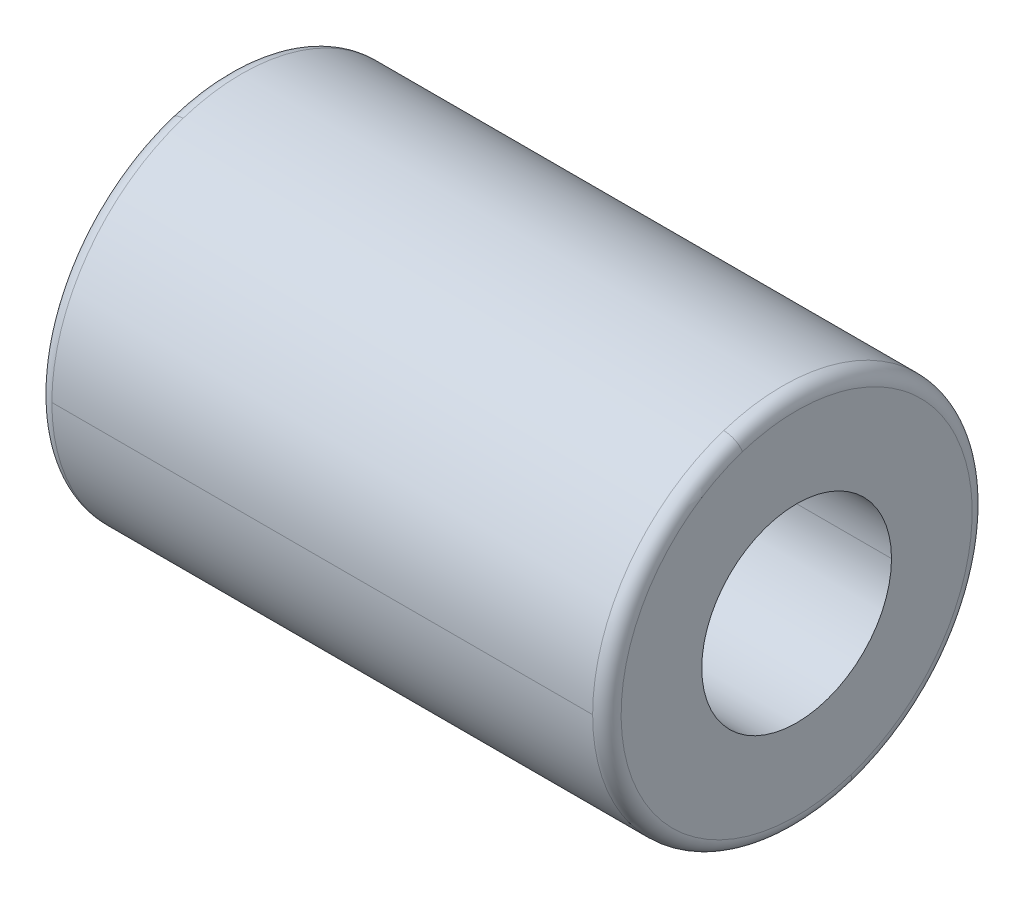
ISO-10303-21;
HEADER;
FILE_DESCRIPTION(('STEP AP214'),'2;1');
FILE_NAME('part.step','',(''),(''),'','','');
FILE_SCHEMA(('AUTOMOTIVE_DESIGN { 1 0 10303 214 1 1 1 1 }'));
ENDSEC;
DATA;
#1=APPLICATION_CONTEXT('core data for automotive mechanical design processes');
#2=APPLICATION_PROTOCOL_DEFINITION('international standard','automotive_design',2000,#1);
#3=PRODUCT_CONTEXT('',#1,'mechanical');
#4=PRODUCT('Part','Part','',(#3));
#5=PRODUCT_RELATED_PRODUCT_CATEGORY('part','',(#4));
#6=PRODUCT_DEFINITION_FORMATION('','',#4);
#7=PRODUCT_DEFINITION_CONTEXT('part definition',#1,'design');
#8=PRODUCT_DEFINITION('design','',#6,#7);
#9=PRODUCT_DEFINITION_SHAPE('','',#8);
#10=(LENGTH_UNIT() NAMED_UNIT(*) SI_UNIT(.MILLI.,.METRE.));
#11=(NAMED_UNIT(*) PLANE_ANGLE_UNIT() SI_UNIT($,.RADIAN.));
#12=(NAMED_UNIT(*) SI_UNIT($,.STERADIAN.) SOLID_ANGLE_UNIT());
#13=UNCERTAINTY_MEASURE_WITH_UNIT(LENGTH_MEASURE(1.E-05),#10,'distance_accuracy_value','');
#14=(GEOMETRIC_REPRESENTATION_CONTEXT(3) GLOBAL_UNCERTAINTY_ASSIGNED_CONTEXT((#13)) GLOBAL_UNIT_ASSIGNED_CONTEXT((#10,
#11,#12)) REPRESENTATION_CONTEXT('',''));
#15=CARTESIAN_POINT('',(0.,0.,0.));
#16=DIRECTION('',(0.,0.,1.));
#17=DIRECTION('',(1.,0.,0.));
#18=AXIS2_PLACEMENT_3D('',#15,#16,#17);
#19=CARTESIAN_POINT('',(12.,0.,0.));
#20=DIRECTION('',(1.,0.,0.));
#21=DIRECTION('',(0.,1.,0.));
#22=AXIS2_PLACEMENT_3D('',#19,#20,#21);
#23=CYLINDRICAL_SURFACE('',#22,2.);
#24=DIRECTION('',(1.,0.,0.));
#25=VECTOR('',#24,1.);
#26=CARTESIAN_POINT('',(0.,0.,2.));
#27=LINE('',#26,#25);
#28=CARTESIAN_POINT('',(0.,0.,2.));
#29=VERTEX_POINT('',#28);
#30=CARTESIAN_POINT('',(12.,0.,2.));
#31=VERTEX_POINT('',#30);
#32=EDGE_CURVE('E27',#29,#31,#27,.T.);
#33=ORIENTED_EDGE('',*,*,#32,.T.);
#34=CARTESIAN_POINT('',(12.,0.,0.));
#35=DIRECTION('',(1.,0.,0.));
#36=DIRECTION('',(0.,0.,-1.));
#37=AXIS2_PLACEMENT_3D('',#34,#35,#36);
#38=CIRCLE('',#37,2.);
#39=CARTESIAN_POINT('',(12.,0.,-2.));
#40=VERTEX_POINT('',#39);
#41=EDGE_CURVE('E167',#31,#40,#38,.T.);
#42=ORIENTED_EDGE('',*,*,#41,.T.);
#43=DIRECTION('',(1.,0.,0.));
#44=VECTOR('',#43,1.);
#45=CARTESIAN_POINT('',(0.,0.,-2.));
#46=LINE('',#45,#44);
#47=CARTESIAN_POINT('',(0.,0.,-2.));
#48=VERTEX_POINT('',#47);
#49=EDGE_CURVE('E11',#48,#40,#46,.T.);
#50=ORIENTED_EDGE('',*,*,#49,.F.);
#51=CARTESIAN_POINT('',(0.,0.,0.));
#52=DIRECTION('',(1.,0.,0.));
#53=DIRECTION('',(0.,0.,-1.));
#54=AXIS2_PLACEMENT_3D('',#51,#52,#53);
#55=CIRCLE('',#54,2.);
#56=EDGE_CURVE('E129',#29,#48,#55,.T.);
#57=ORIENTED_EDGE('',*,*,#56,.F.);
#58=EDGE_LOOP('',(#33,#42,#50,#57));
#59=FACE_BOUND('',#58,.T.);
#60=ADVANCED_FACE('F17',(#59),#23,.F.);
#61=CARTESIAN_POINT('',(12.,0.,0.));
#62=DIRECTION('',(1.,0.,0.));
#63=DIRECTION('',(0.,-1.,0.));
#64=AXIS2_PLACEMENT_3D('',#61,#62,#63);
#65=CYLINDRICAL_SURFACE('',#64,2.);
#66=ORIENTED_EDGE('',*,*,#32,.F.);
#67=CARTESIAN_POINT('',(0.,0.,0.));
#68=DIRECTION('',(1.,0.,0.));
#69=DIRECTION('',(0.,0.,-1.));
#70=AXIS2_PLACEMENT_3D('',#67,#68,#69);
#71=CIRCLE('',#70,2.);
#72=EDGE_CURVE('E135',#48,#29,#71,.T.);
#73=ORIENTED_EDGE('',*,*,#72,.F.);
#74=ORIENTED_EDGE('',*,*,#49,.T.);
#75=CARTESIAN_POINT('',(12.,0.,0.));
#76=DIRECTION('',(1.,0.,0.));
#77=DIRECTION('',(0.,0.,-1.));
#78=AXIS2_PLACEMENT_3D('',#75,#76,#77);
#79=CIRCLE('',#78,2.);
#80=EDGE_CURVE('E171',#40,#31,#79,.T.);
#81=ORIENTED_EDGE('',*,*,#80,.T.);
#82=EDGE_LOOP('',(#66,#73,#74,#81));
#83=FACE_BOUND('',#82,.T.);
#84=ADVANCED_FACE('F19',(#83),#65,.F.);
#85=CARTESIAN_POINT('',(12.,2.,0.));
#86=DIRECTION('',(1.,0.,0.));
#87=DIRECTION('',(0.,1.,0.));
#88=AXIS2_PLACEMENT_3D('',#85,#86,#87);
#89=PLANE('',#88);
#90=ORIENTED_EDGE('',*,*,#41,.F.);
#91=ORIENTED_EDGE('',*,*,#80,.F.);
#92=EDGE_LOOP('',(#90,#91));
#93=FACE_BOUND('',#92,.T.);
#94=CARTESIAN_POINT('',(12.,0.,0.));
#95=DIRECTION('',(1.,0.,0.));
#96=DIRECTION('',(0.,0.,-1.));
#97=AXIS2_PLACEMENT_3D('',#94,#95,#96);
#98=CIRCLE('',#97,3.7);
#99=CARTESIAN_POINT('',(12.,3.51890911029219,1.14336287918734));
#100=VERTEX_POINT('',#99);
#101=CARTESIAN_POINT('',(12.,-3.51890911029219,-1.14336287918734));
#102=VERTEX_POINT('',#101);
#103=EDGE_CURVE('E180',#100,#102,#98,.T.);
#104=ORIENTED_EDGE('',*,*,#103,.T.);
#105=CARTESIAN_POINT('',(12.,-3.51890911029219,-1.14336287918734));
#106=CARTESIAN_POINT('',(12.,-3.36910297550039,-1.60378217268987));
#107=CARTESIAN_POINT('',(12.,-3.12806813330509,-2.03470154835155));
#108=CARTESIAN_POINT('',(12.,-2.4989718462276,-2.77127048744149));
#109=CARTESIAN_POINT('',(12.,-2.11125877391178,-3.0767677219463));
#110=CARTESIAN_POINT('',(12.,-1.24816790788591,-3.51651210495486));
#111=CARTESIAN_POINT('',(12.,-0.773138486742236,-3.65060692453518));
#112=CARTESIAN_POINT('',(12.,0.192440048598407,-3.72673043226157));
#113=CARTESIAN_POINT('',(12.,0.682640790229002,-3.6686067914842));
#114=CARTESIAN_POINT('',(12.,1.60408496814561,-3.36921142909995));
#115=CARTESIAN_POINT('',(12.,2.03482991763845,-3.12810167567049));
#116=CARTESIAN_POINT('',(12.,2.77125508693836,-2.49896364124502));
#117=CARTESIAN_POINT('',(12.,3.07674300411356,-2.11126336519362));
#118=CARTESIAN_POINT('',(12.,3.51652291930739,-1.24819060372042));
#119=CARTESIAN_POINT('',(12.,3.65062261469415,-0.773146123243235));
#120=CARTESIAN_POINT('',(12.,3.72662784234425,0.192524185825352));
#121=CARTESIAN_POINT('',(12.,3.66834107197572,0.682822009472131));
#122=CARTESIAN_POINT('',(12.,3.51890911029219,1.14336287918734));
#123=(BOUNDED_CURVE() B_SPLINE_CURVE(3,(#105,#106,#107,#108,#109,#110,#111,#112,#113,#114,#115,
#116,#117,#118,#119,#120,#121,#122),.UNSPECIFIED.,.F.,.F.) B_SPLINE_CURVE_WITH_KNOTS((4,2,2,2,2,
2,2,2,4),(0.,0.392699081698724,0.785398163397448,1.17809724509617,1.5707963267949,
1.96349540849362,2.35619449019234,2.74889357189107,3.1415926535898),
.UNSPECIFIED.) CURVE() GEOMETRIC_REPRESENTATION_ITEM() RATIONAL_B_SPLINE_CURVE((1.,1.,1.,1.,1.,
1.,1.,1.,1.,1.,1.,1.,1.,1.,1.,1.,1.,1.)) REPRESENTATION_ITEM(''));
#124=EDGE_CURVE('E100',#102,#100,#123,.T.);
#125=ORIENTED_EDGE('',*,*,#124,.T.);
#126=EDGE_LOOP('',(#104,#125));
#127=FACE_BOUND('',#126,.T.);
#128=ADVANCED_FACE('F223',(#93,#127),#89,.T.);
#129=CARTESIAN_POINT('',(11.7000000000001,0.,0.));
#130=DIRECTION('',(1.,0.,0.));
#131=DIRECTION('',(0.,-0.309016994374948,0.951056516295154));
#132=AXIS2_PLACEMENT_3D('',#129,#130,#131);
#133=TOROIDAL_SURFACE('',#132,3.70000000000012,0.299999999999873);
#134=CARTESIAN_POINT('',(11.7000000000001,-3.51890911029219,-1.14336287918734));
#135=DIRECTION('',(0.,0.309016994374947,-0.951056516295154));
#136=DIRECTION('',(1.,0.,0.));
#137=AXIS2_PLACEMENT_3D('',#134,#135,#136);
#138=CIRCLE('',#137,0.299999999999873);
#139=CARTESIAN_POINT('',(11.7,-3.80422606518061,-1.23606797749979));
#140=VERTEX_POINT('',#139);
#141=EDGE_CURVE('E146',#102,#140,#138,.T.);
#142=ORIENTED_EDGE('',*,*,#141,.T.);
#143=CARTESIAN_POINT('',(11.7,0.,0.));
#144=DIRECTION('',(1.,0.,0.));
#145=DIRECTION('',(0.,0.,-1.));
#146=AXIS2_PLACEMENT_3D('',#143,#144,#145);
#147=CIRCLE('',#146,4.);
#148=CARTESIAN_POINT('',(11.7,0.,-4.));
#149=VERTEX_POINT('',#148);
#150=EDGE_CURVE('E162',#140,#149,#147,.T.);
#151=ORIENTED_EDGE('',*,*,#150,.T.);
#152=CARTESIAN_POINT('',(11.7,0.,0.));
#153=DIRECTION('',(1.,0.,0.));
#154=DIRECTION('',(0.,0.,-1.));
#155=AXIS2_PLACEMENT_3D('',#152,#153,#154);
#156=CIRCLE('',#155,4.);
#157=CARTESIAN_POINT('',(11.7,3.80422606518061,1.23606797749979));
#158=VERTEX_POINT('',#157);
#159=EDGE_CURVE('E89',#149,#158,#156,.T.);
#160=ORIENTED_EDGE('',*,*,#159,.T.);
#161=CARTESIAN_POINT('',(11.7000000000001,3.51890911029219,1.14336287918734));
#162=DIRECTION('',(0.,-0.309016994374948,0.951056516295154));
#163=DIRECTION('',(1.,0.,0.));
#164=AXIS2_PLACEMENT_3D('',#161,#162,#163);
#165=CIRCLE('',#164,0.299999999999873);
#166=EDGE_CURVE('E175',#100,#158,#165,.T.);
#167=ORIENTED_EDGE('',*,*,#166,.F.);
#168=ORIENTED_EDGE('',*,*,#124,.F.);
#169=EDGE_LOOP('',(#142,#151,#160,#167,#168));
#170=FACE_BOUND('',#169,.T.);
#171=ADVANCED_FACE('F225',(#170),#133,.T.);
#172=CARTESIAN_POINT('',(0.299999999999939,0.,0.));
#173=DIRECTION('',(1.,0.,0.));
#174=DIRECTION('',(0.,0.309016994374948,-0.951056516295154));
#175=AXIS2_PLACEMENT_3D('',#172,#173,#174);
#176=TOROIDAL_SURFACE('',#175,3.70000000000006,0.299999999999939);
#177=CARTESIAN_POINT('',(0.299999999999939,-3.51890911029213,-1.14336287918732));
#178=DIRECTION('',(0.,0.309016994374948,-0.951056516295154));
#179=DIRECTION('',(2.0455280987564E-13,-0.951056516295154,-0.309016994374948));
#180=AXIS2_PLACEMENT_3D('',#177,#178,#179);
#181=CIRCLE('',#180,0.299999999999939);
#182=CARTESIAN_POINT('',(0.299999999999994,-3.80422606518061,-1.23606797749979));
#183=VERTEX_POINT('',#182);
#184=CARTESIAN_POINT('',(0.,-3.51890911029213,-1.14336287918732));
#185=VERTEX_POINT('',#184);
#186=EDGE_CURVE('E119',#183,#185,#181,.T.);
#187=ORIENTED_EDGE('',*,*,#186,.F.);
#188=CARTESIAN_POINT('',(0.299999999999994,0.,0.));
#189=DIRECTION('',(1.,0.,0.));
#190=DIRECTION('',(0.,0.,-1.));
#191=AXIS2_PLACEMENT_3D('',#188,#189,#190);
#192=CIRCLE('',#191,4.);
#193=CARTESIAN_POINT('',(0.299999999999994,0.,4.));
#194=VERTEX_POINT('',#193);
#195=EDGE_CURVE('E187',#194,#183,#192,.T.);
#196=ORIENTED_EDGE('',*,*,#195,.F.);
#197=CARTESIAN_POINT('',(0.299999999999994,0.,0.));
#198=DIRECTION('',(1.,0.,0.));
#199=DIRECTION('',(0.,0.,-1.));
#200=AXIS2_PLACEMENT_3D('',#197,#198,#199);
#201=CIRCLE('',#200,4.);
#202=CARTESIAN_POINT('',(0.299999999999994,3.80422606518061,1.23606797749979));
#203=VERTEX_POINT('',#202);
#204=EDGE_CURVE('E205',#203,#194,#201,.T.);
#205=ORIENTED_EDGE('',*,*,#204,.F.);
#206=CARTESIAN_POINT('',(0.299999999999939,3.51890911029213,1.14336287918732));
#207=DIRECTION('',(0.,-0.309016994374948,0.951056516295154));
#208=DIRECTION('',(2.0455280987564E-13,0.951056516295154,0.309016994374948));
#209=AXIS2_PLACEMENT_3D('',#206,#207,#208);
#210=CIRCLE('',#209,0.299999999999939);
#211=CARTESIAN_POINT('',(0.,3.51890911029213,1.14336287918732));
#212=VERTEX_POINT('',#211);
#213=EDGE_CURVE('E111',#203,#212,#210,.T.);
#214=ORIENTED_EDGE('',*,*,#213,.T.);
#215=CARTESIAN_POINT('',(0.,3.51890911029213,1.14336287918732));
#216=CARTESIAN_POINT('',(0.,3.36924325939036,1.603987004585));
#217=CARTESIAN_POINT('',(0.,3.12804851042152,2.03467121871684));
#218=CARTESIAN_POINT('',(0.,2.49895563501879,2.77124433892662));
#219=CARTESIAN_POINT('',(0.,2.11130502976784,3.07684343493489));
#220=CARTESIAN_POINT('',(0.,1.24822466830485,3.51660484405914));
#221=CARTESIAN_POINT('',(0.,0.773134497359766,3.65059412983931));
#222=CARTESIAN_POINT('',(0.,-0.192537188973715,3.72659413978596));
#223=CARTESIAN_POINT('',(0.,-0.682738753789666,3.66857496119388));
#224=CARTESIAN_POINT('',(0.,-1.603987004585,3.36924325939036));
#225=CARTESIAN_POINT('',(0.,-2.03467121871684,3.12804851042152));
#226=CARTESIAN_POINT('',(0.,-2.77124433892661,2.49895563501879));
#227=CARTESIAN_POINT('',(0.,-3.07684343493489,2.11130502976784));
#228=CARTESIAN_POINT('',(0.,-3.51660484405914,1.24822466830485));
#229=CARTESIAN_POINT('',(0.,-3.65059412983931,0.773134497359767));
#230=CARTESIAN_POINT('',(0.,-3.72659413978596,-0.192537188973713));
#231=CARTESIAN_POINT('',(0.,-3.66857496119388,-0.682738753789663));
#232=CARTESIAN_POINT('',(0.,-3.51890911029213,-1.14336287918732));
#233=(BOUNDED_CURVE() B_SPLINE_CURVE(3,(#215,#216,#217,#218,#219,#220,#221,#222,#223,#224,#225,
#226,#227,#228,#229,#230,#231,#232),.UNSPECIFIED.,.F.,.F.) B_SPLINE_CURVE_WITH_KNOTS((4,2,2,2,2,
2,2,2,4),(0.,0.392699081698724,0.785398163397448,1.17809724509617,1.5707963267949,
1.96349540849362,2.35619449019234,2.74889357189107,3.14159265358979),
.UNSPECIFIED.) CURVE() GEOMETRIC_REPRESENTATION_ITEM() RATIONAL_B_SPLINE_CURVE((1.,1.,1.,1.,1.,
1.,1.,1.,1.,1.,1.,1.,1.,1.,1.,1.,1.,1.)) REPRESENTATION_ITEM(''));
#234=EDGE_CURVE('E133',#212,#185,#233,.T.);
#235=ORIENTED_EDGE('',*,*,#234,.T.);
#236=EDGE_LOOP('',(#187,#196,#205,#214,#235));
#237=FACE_BOUND('',#236,.T.);
#238=ADVANCED_FACE('F137',(#237),#176,.T.);
#239=CARTESIAN_POINT('',(12.,0.,0.));
#240=DIRECTION('',(1.,0.,0.));
#241=DIRECTION('',(0.,-1.,0.));
#242=AXIS2_PLACEMENT_3D('',#239,#240,#241);
#243=CYLINDRICAL_SURFACE('',#242,4.);
#244=DIRECTION('',(1.,0.,0.));
#245=VECTOR('',#244,1.);
#246=CARTESIAN_POINT('',(0.299999999999994,0.,4.));
#247=LINE('',#246,#245);
#248=CARTESIAN_POINT('',(11.7,0.,4.));
#249=VERTEX_POINT('',#248);
#250=EDGE_CURVE('E186',#194,#249,#247,.T.);
#251=ORIENTED_EDGE('',*,*,#250,.T.);
#252=CARTESIAN_POINT('',(11.7,0.,0.));
#253=DIRECTION('',(1.,0.,0.));
#254=DIRECTION('',(0.,0.,-1.));
#255=AXIS2_PLACEMENT_3D('',#252,#253,#254);
#256=CIRCLE('',#255,4.);
#257=EDGE_CURVE('E179',#158,#249,#256,.T.);
#258=ORIENTED_EDGE('',*,*,#257,.F.);
#259=ORIENTED_EDGE('',*,*,#159,.F.);
#260=DIRECTION('',(1.,0.,0.));
#261=VECTOR('',#260,1.);
#262=CARTESIAN_POINT('',(0.299999999999994,0.,-4.));
#263=LINE('',#262,#261);
#264=CARTESIAN_POINT('',(0.299999999999994,0.,-4.));
#265=VERTEX_POINT('',#264);
#266=EDGE_CURVE('E166',#265,#149,#263,.T.);
#267=ORIENTED_EDGE('',*,*,#266,.F.);
#268=CARTESIAN_POINT('',(0.299999999999994,0.,0.));
#269=DIRECTION('',(1.,0.,0.));
#270=DIRECTION('',(0.,0.,-1.));
#271=AXIS2_PLACEMENT_3D('',#268,#269,#270);
#272=CIRCLE('',#271,4.);
#273=EDGE_CURVE('E174',#265,#203,#272,.T.);
#274=ORIENTED_EDGE('',*,*,#273,.T.);
#275=ORIENTED_EDGE('',*,*,#204,.T.);
#276=EDGE_LOOP('',(#251,#258,#259,#267,#274,#275));
#277=FACE_BOUND('',#276,.T.);
#278=ADVANCED_FACE('F345',(#277),#243,.T.);
#279=CARTESIAN_POINT('',(11.7000000000001,0.,0.));
#280=DIRECTION('',(1.,0.,0.));
#281=DIRECTION('',(0.,0.309016994374948,-0.951056516295154));
#282=AXIS2_PLACEMENT_3D('',#279,#280,#281);
#283=TOROIDAL_SURFACE('',#282,3.70000000000012,0.299999999999873);
#284=ORIENTED_EDGE('',*,*,#141,.F.);
#285=ORIENTED_EDGE('',*,*,#103,.F.);
#286=ORIENTED_EDGE('',*,*,#166,.T.);
#287=ORIENTED_EDGE('',*,*,#257,.T.);
#288=CARTESIAN_POINT('',(11.7,0.,0.));
#289=DIRECTION('',(1.,0.,0.));
#290=DIRECTION('',(0.,0.,-1.));
#291=AXIS2_PLACEMENT_3D('',#288,#289,#290);
#292=CIRCLE('',#291,4.);
#293=EDGE_CURVE('E165',#249,#140,#292,.T.);
#294=ORIENTED_EDGE('',*,*,#293,.T.);
#295=EDGE_LOOP('',(#284,#285,#286,#287,#294));
#296=FACE_BOUND('',#295,.T.);
#297=ADVANCED_FACE('F229',(#296),#283,.T.);
#298=CARTESIAN_POINT('',(12.,0.,0.));
#299=DIRECTION('',(1.,0.,0.));
#300=DIRECTION('',(0.,1.,0.));
#301=AXIS2_PLACEMENT_3D('',#298,#299,#300);
#302=CYLINDRICAL_SURFACE('',#301,4.);
#303=ORIENTED_EDGE('',*,*,#250,.F.);
#304=ORIENTED_EDGE('',*,*,#195,.T.);
#305=CARTESIAN_POINT('',(0.299999999999994,0.,0.));
#306=DIRECTION('',(1.,0.,0.));
#307=DIRECTION('',(0.,0.,-1.));
#308=AXIS2_PLACEMENT_3D('',#305,#306,#307);
#309=CIRCLE('',#308,4.);
#310=EDGE_CURVE('E126',#183,#265,#309,.T.);
#311=ORIENTED_EDGE('',*,*,#310,.T.);
#312=ORIENTED_EDGE('',*,*,#266,.T.);
#313=ORIENTED_EDGE('',*,*,#150,.F.);
#314=ORIENTED_EDGE('',*,*,#293,.F.);
#315=EDGE_LOOP('',(#303,#304,#311,#312,#313,#314));
#316=FACE_BOUND('',#315,.T.);
#317=ADVANCED_FACE('F325',(#316),#302,.T.);
#318=CARTESIAN_POINT('',(0.299999999999939,0.,0.));
#319=DIRECTION('',(1.,0.,0.));
#320=DIRECTION('',(0.,-0.309016994374948,0.951056516295154));
#321=AXIS2_PLACEMENT_3D('',#318,#319,#320);
#322=TOROIDAL_SURFACE('',#321,3.70000000000006,0.299999999999939);
#323=ORIENTED_EDGE('',*,*,#186,.T.);
#324=CARTESIAN_POINT('',(0.,-3.51890911029213,-1.14336287918732));
#325=CARTESIAN_POINT('',(0.,-3.36924325939036,-1.603987004585));
#326=CARTESIAN_POINT('',(0.,-3.12804851042152,-2.03467121871684));
#327=CARTESIAN_POINT('',(0.,-2.49895563501879,-2.77124433892661));
#328=CARTESIAN_POINT('',(0.,-2.11130502976784,-3.07684343493489));
#329=CARTESIAN_POINT('',(0.,-1.24822466830485,-3.51660484405914));
#330=CARTESIAN_POINT('',(0.,-0.77313449735977,-3.65059412983931));
#331=CARTESIAN_POINT('',(0.,0.192537188973709,-3.72659413978596));
#332=CARTESIAN_POINT('',(0.,0.68273875378966,-3.66857496119388));
#333=CARTESIAN_POINT('',(0.,1.60398700458499,-3.36924325939037));
#334=CARTESIAN_POINT('',(0.,2.03467121871683,-3.12804851042152));
#335=CARTESIAN_POINT('',(0.,2.77124433892661,-2.4989556350188));
#336=CARTESIAN_POINT('',(0.,3.07684343493489,-2.11130502976785));
#337=CARTESIAN_POINT('',(0.,3.51660484405914,-1.24822466830486));
#338=CARTESIAN_POINT('',(0.,3.6505941298393,-0.77313449735978));
#339=CARTESIAN_POINT('',(0.,3.72659413978596,0.192537188973699));
#340=CARTESIAN_POINT('',(0.,3.66857496119388,0.68273875378965));
#341=CARTESIAN_POINT('',(0.,3.51890911029213,1.14336287918732));
#342=(BOUNDED_CURVE() B_SPLINE_CURVE(3,(#324,#325,#326,#327,#328,#329,#330,#331,#332,#333,#334,
#335,#336,#337,#338,#339,#340,#341),.UNSPECIFIED.,.F.,.F.) B_SPLINE_CURVE_WITH_KNOTS((4,2,2,2,2,
2,2,2,4),(0.,0.392699081698724,0.785398163397447,1.17809724509617,1.5707963267949,
1.96349540849361,2.35619449019234,2.74889357189106,3.14159265358979),
.UNSPECIFIED.) CURVE() GEOMETRIC_REPRESENTATION_ITEM() RATIONAL_B_SPLINE_CURVE((1.,1.,1.,1.,1.,
1.,1.,1.,1.,1.,1.,1.,1.,1.,1.,1.,1.,1.)) REPRESENTATION_ITEM(''));
#343=EDGE_CURVE('E122',#185,#212,#342,.T.);
#344=ORIENTED_EDGE('',*,*,#343,.T.);
#345=ORIENTED_EDGE('',*,*,#213,.F.);
#346=ORIENTED_EDGE('',*,*,#273,.F.);
#347=ORIENTED_EDGE('',*,*,#310,.F.);
#348=EDGE_LOOP('',(#323,#344,#345,#346,#347));
#349=FACE_BOUND('',#348,.T.);
#350=ADVANCED_FACE('F121',(#349),#322,.T.);
#351=CARTESIAN_POINT('',(0.,3.7,0.));
#352=DIRECTION('',(-1.,0.,0.));
#353=DIRECTION('',(0.,0.,1.));
#354=AXIS2_PLACEMENT_3D('',#351,#352,#353);
#355=PLANE('',#354);
#356=ORIENTED_EDGE('',*,*,#72,.T.);
#357=ORIENTED_EDGE('',*,*,#56,.T.);
#358=EDGE_LOOP('',(#356,#357));
#359=FACE_BOUND('',#358,.T.);
#360=ORIENTED_EDGE('',*,*,#234,.F.);
#361=ORIENTED_EDGE('',*,*,#343,.F.);
#362=EDGE_LOOP('',(#360,#361));
#363=FACE_BOUND('',#362,.T.);
#364=ADVANCED_FACE('F132',(#359,#363),#355,.T.);
#365=CLOSED_SHELL('',(#60,#84,#128,#171,#238,#278,#297,#317,#350,#364));
#366=MANIFOLD_SOLID_BREP('B1',#365);
#367=ADVANCED_BREP_SHAPE_REPRESENTATION('',(#18,#366),#14);
#368=SHAPE_DEFINITION_REPRESENTATION(#9,#367);
ENDSEC;
END-ISO-10303-21;
